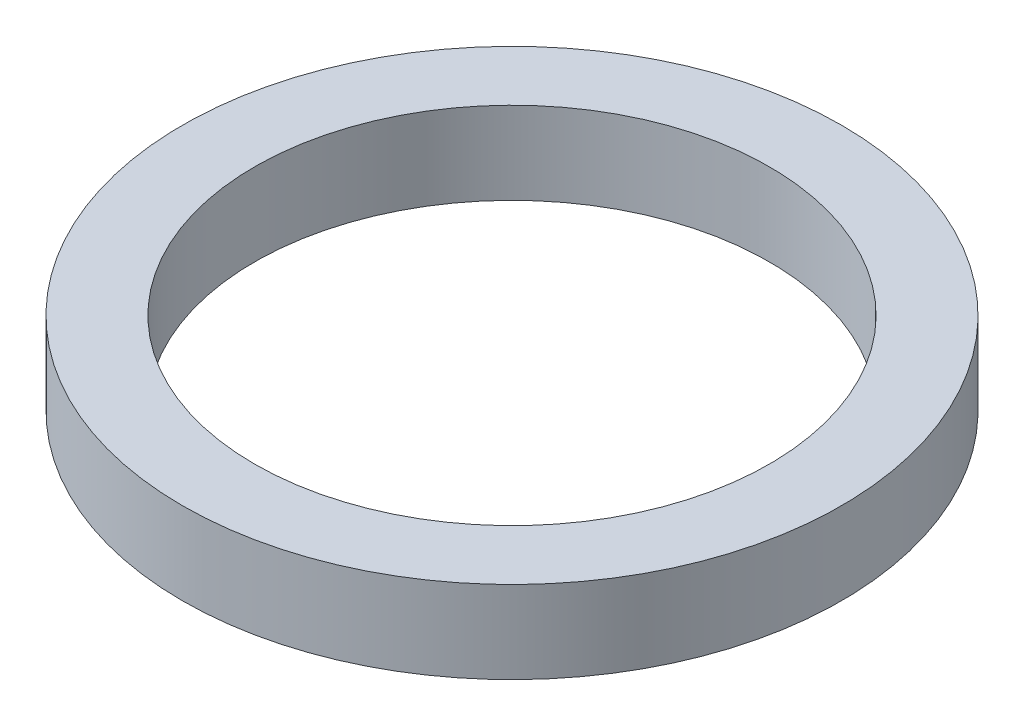
ISO-10303-21;
HEADER;
FILE_DESCRIPTION(('STEP AP214'),'2;1');
FILE_NAME('part.step','',(''),(''),'','','');
FILE_SCHEMA(('AUTOMOTIVE_DESIGN { 1 0 10303 214 1 1 1 1 }'));
ENDSEC;
DATA;
#1=APPLICATION_CONTEXT('core data for automotive mechanical design processes');
#2=APPLICATION_PROTOCOL_DEFINITION('international standard','automotive_design',2000,#1);
#3=PRODUCT_CONTEXT('',#1,'mechanical');
#4=PRODUCT('Part','Part','',(#3));
#5=PRODUCT_RELATED_PRODUCT_CATEGORY('part','',(#4));
#6=PRODUCT_DEFINITION_FORMATION('','',#4);
#7=PRODUCT_DEFINITION_CONTEXT('part definition',#1,'design');
#8=PRODUCT_DEFINITION('design','',#6,#7);
#9=PRODUCT_DEFINITION_SHAPE('','',#8);
#10=(LENGTH_UNIT() NAMED_UNIT(*) SI_UNIT(.MILLI.,.METRE.));
#11=(NAMED_UNIT(*) PLANE_ANGLE_UNIT() SI_UNIT($,.RADIAN.));
#12=(NAMED_UNIT(*) SI_UNIT($,.STERADIAN.) SOLID_ANGLE_UNIT());
#13=UNCERTAINTY_MEASURE_WITH_UNIT(LENGTH_MEASURE(1.E-05),#10,'distance_accuracy_value','');
#14=(GEOMETRIC_REPRESENTATION_CONTEXT(3) GLOBAL_UNCERTAINTY_ASSIGNED_CONTEXT((#13)) GLOBAL_UNIT_ASSIGNED_CONTEXT((#10,
#11,#12)) REPRESENTATION_CONTEXT('',''));
#15=CARTESIAN_POINT('',(0.,0.,0.));
#16=DIRECTION('',(0.,0.,1.));
#17=DIRECTION('',(1.,0.,0.));
#18=AXIS2_PLACEMENT_3D('',#15,#16,#17);
#19=CARTESIAN_POINT('',(0.,4.,0.));
#20=DIRECTION('',(0.,1.,0.));
#21=DIRECTION('',(0.,0.,1.));
#22=AXIS2_PLACEMENT_3D('',#19,#20,#21);
#23=PLANE('',#22);
#24=CARTESIAN_POINT('',(0.,4.,0.));
#25=DIRECTION('',(0.,1.,0.));
#26=DIRECTION('',(0.,0.,1.));
#27=AXIS2_PLACEMENT_3D('',#24,#25,#26);
#28=CIRCLE('',#27,16.);
#29=CARTESIAN_POINT('',(0.,4.,16.));
#30=VERTEX_POINT('',#29);
#31=EDGE_CURVE('E10',#30,#30,#28,.T.);
#32=ORIENTED_EDGE('',*,*,#31,.T.);
#33=EDGE_LOOP('',(#32));
#34=FACE_BOUND('',#33,.T.);
#35=CARTESIAN_POINT('',(0.,4.,0.));
#36=DIRECTION('',(0.,1.,0.));
#37=DIRECTION('',(0.,0.,1.));
#38=AXIS2_PLACEMENT_3D('',#35,#36,#37);
#39=CIRCLE('',#38,12.5);
#40=CARTESIAN_POINT('',(0.,4.,12.5));
#41=VERTEX_POINT('',#40);
#42=EDGE_CURVE('E42',#41,#41,#39,.T.);
#43=ORIENTED_EDGE('',*,*,#42,.F.);
#44=EDGE_LOOP('',(#43));
#45=FACE_BOUND('',#44,.T.);
#46=ADVANCED_FACE('F31',(#34,#45),#23,.T.);
#47=CARTESIAN_POINT('',(0.,0.,0.));
#48=DIRECTION('',(0.,1.,0.));
#49=DIRECTION('',(0.,0.,1.));
#50=AXIS2_PLACEMENT_3D('',#47,#48,#49);
#51=PLANE('',#50);
#52=CARTESIAN_POINT('',(0.,0.,0.));
#53=DIRECTION('',(0.,1.,0.));
#54=DIRECTION('',(0.,0.,1.));
#55=AXIS2_PLACEMENT_3D('',#52,#53,#54);
#56=CIRCLE('',#55,16.);
#57=CARTESIAN_POINT('',(0.,0.,16.));
#58=VERTEX_POINT('',#57);
#59=EDGE_CURVE('E35',#58,#58,#56,.T.);
#60=ORIENTED_EDGE('',*,*,#59,.F.);
#61=EDGE_LOOP('',(#60));
#62=FACE_BOUND('',#61,.T.);
#63=CARTESIAN_POINT('',(0.,0.,0.));
#64=DIRECTION('',(0.,1.,0.));
#65=DIRECTION('',(0.,0.,1.));
#66=AXIS2_PLACEMENT_3D('',#63,#64,#65);
#67=CIRCLE('',#66,12.5);
#68=CARTESIAN_POINT('',(0.,0.,12.5));
#69=VERTEX_POINT('',#68);
#70=EDGE_CURVE('E44',#69,#69,#67,.T.);
#71=ORIENTED_EDGE('',*,*,#70,.T.);
#72=EDGE_LOOP('',(#71));
#73=FACE_BOUND('',#72,.T.);
#74=ADVANCED_FACE('F54',(#62,#73),#51,.F.);
#75=CARTESIAN_POINT('',(0.,4.,0.));
#76=DIRECTION('',(0.,-1.,0.));
#77=DIRECTION('',(0.,0.,-1.));
#78=AXIS2_PLACEMENT_3D('',#75,#76,#77);
#79=CYLINDRICAL_SURFACE('',#78,16.);
#80=ORIENTED_EDGE('',*,*,#31,.F.);
#81=EDGE_LOOP('',(#80));
#82=FACE_BOUND('',#81,.T.);
#83=ORIENTED_EDGE('',*,*,#59,.T.);
#84=EDGE_LOOP('',(#83));
#85=FACE_BOUND('',#84,.T.);
#86=ADVANCED_FACE('F33',(#82,#85),#79,.T.);
#87=CARTESIAN_POINT('',(0.,4.,0.));
#88=DIRECTION('',(0.,-1.,0.));
#89=DIRECTION('',(0.,0.,-1.));
#90=AXIS2_PLACEMENT_3D('',#87,#88,#89);
#91=CYLINDRICAL_SURFACE('',#90,12.5);
#92=ORIENTED_EDGE('',*,*,#42,.T.);
#93=EDGE_LOOP('',(#92));
#94=FACE_BOUND('',#93,.T.);
#95=ORIENTED_EDGE('',*,*,#70,.F.);
#96=EDGE_LOOP('',(#95));
#97=FACE_BOUND('',#96,.T.);
#98=ADVANCED_FACE('F50',(#94,#97),#91,.F.);
#99=CLOSED_SHELL('',(#46,#74,#86,#98));
#100=MANIFOLD_SOLID_BREP('B2',#99);
#101=ADVANCED_BREP_SHAPE_REPRESENTATION('',(#18,#100),#14);
#102=SHAPE_DEFINITION_REPRESENTATION(#9,#101);
ENDSEC;
END-ISO-10303-21;
